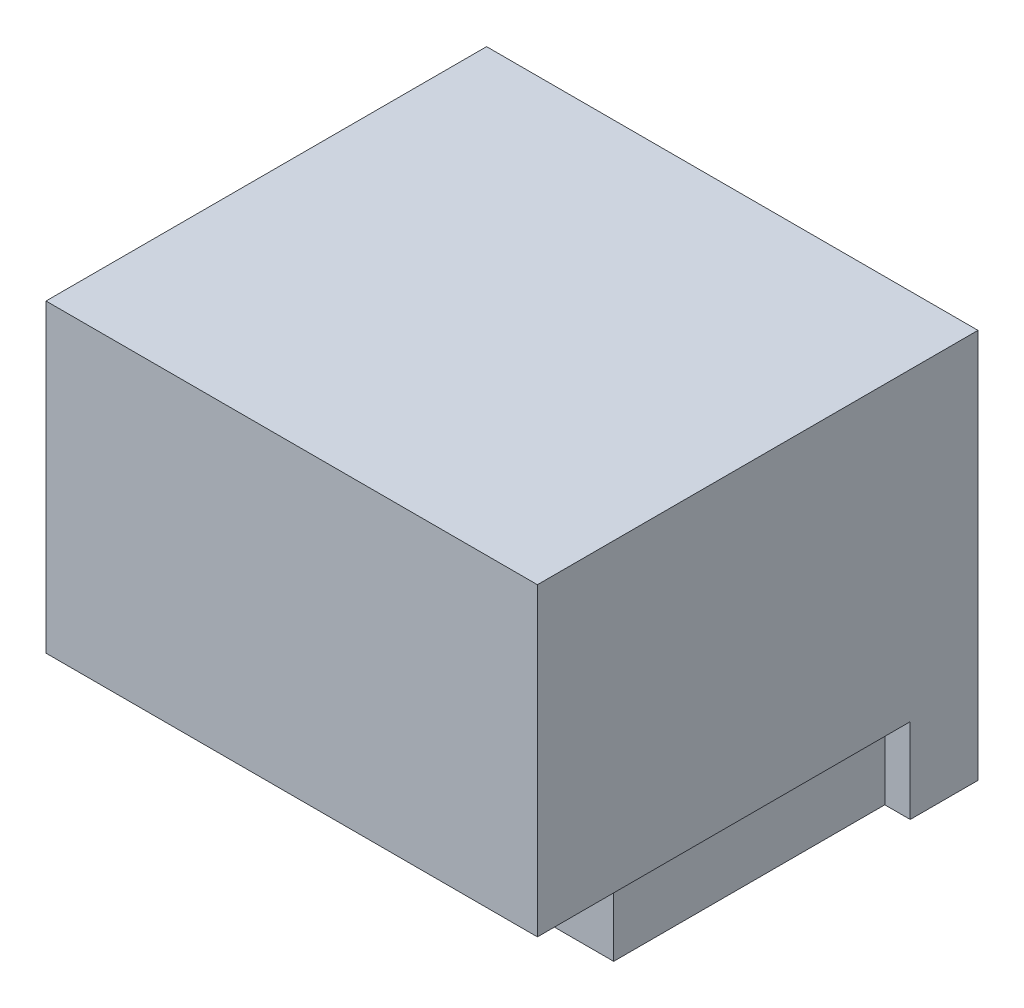
ISO-10303-21;
HEADER;
FILE_DESCRIPTION(('STEP AP214'),'2;1');
FILE_NAME('part.step','',(''),(''),'','','');
FILE_SCHEMA(('AUTOMOTIVE_DESIGN { 1 0 10303 214 1 1 1 1 }'));
ENDSEC;
DATA;
#1=APPLICATION_CONTEXT('core data for automotive mechanical design processes');
#2=APPLICATION_PROTOCOL_DEFINITION('international standard','automotive_design',2000,#1);
#3=PRODUCT_CONTEXT('',#1,'mechanical');
#4=PRODUCT('Part','Part','',(#3));
#5=PRODUCT_RELATED_PRODUCT_CATEGORY('part','',(#4));
#6=PRODUCT_DEFINITION_FORMATION('','',#4);
#7=PRODUCT_DEFINITION_CONTEXT('part definition',#1,'design');
#8=PRODUCT_DEFINITION('design','',#6,#7);
#9=PRODUCT_DEFINITION_SHAPE('','',#8);
#10=(LENGTH_UNIT() NAMED_UNIT(*) SI_UNIT(.MILLI.,.METRE.));
#11=(NAMED_UNIT(*) PLANE_ANGLE_UNIT() SI_UNIT($,.RADIAN.));
#12=(NAMED_UNIT(*) SI_UNIT($,.STERADIAN.) SOLID_ANGLE_UNIT());
#13=UNCERTAINTY_MEASURE_WITH_UNIT(LENGTH_MEASURE(1.E-05),#10,'distance_accuracy_value','');
#14=(GEOMETRIC_REPRESENTATION_CONTEXT(3) GLOBAL_UNCERTAINTY_ASSIGNED_CONTEXT((#13)) GLOBAL_UNIT_ASSIGNED_CONTEXT((#10,
#11,#12)) REPRESENTATION_CONTEXT('',''));
#15=CARTESIAN_POINT('',(0.,0.,0.));
#16=DIRECTION('',(0.,0.,1.));
#17=DIRECTION('',(1.,0.,0.));
#18=AXIS2_PLACEMENT_3D('',#15,#16,#17);
#19=CARTESIAN_POINT('',(0.,0.,0.));
#20=DIRECTION('',(0.,1.,0.));
#21=DIRECTION('',(0.,0.,1.));
#22=AXIS2_PLACEMENT_3D('',#19,#20,#21);
#23=PLANE('',#22);
#24=DIRECTION('',(-1.,0.,0.));
#25=VECTOR('',#24,1.);
#26=CARTESIAN_POINT('',(-5.73575949367089,0.,-3.50632911392403));
#27=LINE('',#26,#25);
#28=CARTESIAN_POINT('',(-4.98575949367089,0.,-3.50632911392403));
#29=VERTEX_POINT('',#28);
#30=CARTESIAN_POINT('',(-5.73575949367089,0.,-3.50632911392403));
#31=VERTEX_POINT('',#30);
#32=EDGE_CURVE('E494',#29,#31,#27,.T.);
#33=ORIENTED_EDGE('',*,*,#32,.F.);
#34=DIRECTION('',(0.,0.,-1.));
#35=VECTOR('',#34,1.);
#36=CARTESIAN_POINT('',(-4.98575949367089,0.,4.49367088607597));
#37=LINE('',#36,#35);
#38=CARTESIAN_POINT('',(-4.98575949367089,0.,4.49367088607597));
#39=VERTEX_POINT('',#38);
#40=EDGE_CURVE('E510',#39,#29,#37,.T.);
#41=ORIENTED_EDGE('',*,*,#40,.F.);
#42=DIRECTION('',(-1.,0.,0.));
#43=VECTOR('',#42,1.);
#44=CARTESIAN_POINT('',(-4.98575949367089,0.,4.49367088607597));
#45=LINE('',#44,#43);
#46=CARTESIAN_POINT('',(8.01424050632911,0.,4.49367088607597));
#47=VERTEX_POINT('',#46);
#48=EDGE_CURVE('E546',#47,#39,#45,.T.);
#49=ORIENTED_EDGE('',*,*,#48,.F.);
#50=DIRECTION('',(0.,0.,1.));
#51=VECTOR('',#50,1.);
#52=CARTESIAN_POINT('',(8.01424050632911,0.,4.49367088607597));
#53=LINE('',#52,#51);
#54=CARTESIAN_POINT('',(8.01424050632911,0.,-3.50632911392403));
#55=VERTEX_POINT('',#54);
#56=EDGE_CURVE('E542',#55,#47,#53,.T.);
#57=ORIENTED_EDGE('',*,*,#56,.F.);
#58=DIRECTION('',(-1.,0.,0.));
#59=VECTOR('',#58,1.);
#60=CARTESIAN_POINT('',(8.01424050632911,0.,-3.50632911392403));
#61=LINE('',#60,#59);
#62=CARTESIAN_POINT('',(8.76424050632911,0.,-3.50632911392403));
#63=VERTEX_POINT('',#62);
#64=EDGE_CURVE('E538',#63,#55,#61,.T.);
#65=ORIENTED_EDGE('',*,*,#64,.F.);
#66=DIRECTION('',(0.,0.,-1.));
#67=VECTOR('',#66,1.);
#68=CARTESIAN_POINT('',(8.76424050632911,0.,-5.50632911392403));
#69=LINE('',#68,#67);
#70=CARTESIAN_POINT('',(8.76424050632911,0.,7.49367088607597));
#71=VERTEX_POINT('',#70);
#72=EDGE_CURVE('E582',#71,#63,#69,.T.);
#73=ORIENTED_EDGE('',*,*,#72,.F.);
#74=DIRECTION('',(1.,0.,0.));
#75=VECTOR('',#74,1.);
#76=CARTESIAN_POINT('',(-5.73575949367089,0.,7.49367088607597));
#77=LINE('',#76,#75);
#78=CARTESIAN_POINT('',(-5.73575949367089,0.,7.49367088607597));
#79=VERTEX_POINT('',#78);
#80=EDGE_CURVE('E594',#79,#71,#77,.T.);
#81=ORIENTED_EDGE('',*,*,#80,.F.);
#82=DIRECTION('',(0.,0.,1.));
#83=VECTOR('',#82,1.);
#84=CARTESIAN_POINT('',(-5.73575949367089,0.,-5.50632911392403));
#85=LINE('',#84,#83);
#86=EDGE_CURVE('E576',#31,#79,#85,.T.);
#87=ORIENTED_EDGE('',*,*,#86,.F.);
#88=EDGE_LOOP('',(#33,#41,#49,#57,#65,#73,#81,#87));
#89=FACE_BOUND('',#88,.T.);
#90=ADVANCED_FACE('F39',(#89),#23,.F.);
#91=CARTESIAN_POINT('',(-5.73575949367089,9.,-5.50632911392403));
#92=DIRECTION('',(1.,0.,0.));
#93=DIRECTION('',(0.,0.,-1.));
#94=AXIS2_PLACEMENT_3D('',#91,#92,#93);
#95=PLANE('',#94);
#96=DIRECTION('',(0.,-1.,0.));
#97=VECTOR('',#96,1.);
#98=CARTESIAN_POINT('',(-5.73575949367089,9.,-5.50632911392403));
#99=LINE('',#98,#97);
#100=CARTESIAN_POINT('',(-5.73575949367089,9.,-5.50632911392403));
#101=VERTEX_POINT('',#100);
#102=CARTESIAN_POINT('',(-5.73575949367089,-2.5,-5.50632911392403));
#103=VERTEX_POINT('',#102);
#104=EDGE_CURVE('E591',#101,#103,#99,.T.);
#105=ORIENTED_EDGE('',*,*,#104,.T.);
#106=DIRECTION('',(0.,0.,-1.));
#107=VECTOR('',#106,1.);
#108=CARTESIAN_POINT('',(-5.73575949367089,-2.5,-3.50632911392403));
#109=LINE('',#108,#107);
#110=CARTESIAN_POINT('',(-5.73575949367089,-2.5,-3.50632911392403));
#111=VERTEX_POINT('',#110);
#112=EDGE_CURVE('E509',#111,#103,#109,.T.);
#113=ORIENTED_EDGE('',*,*,#112,.F.);
#114=DIRECTION('',(0.,1.,0.));
#115=VECTOR('',#114,1.);
#116=CARTESIAN_POINT('',(-5.73575949367089,-2.5,-3.50632911392403));
#117=LINE('',#116,#115);
#118=EDGE_CURVE('E572',#111,#31,#117,.T.);
#119=ORIENTED_EDGE('',*,*,#118,.T.);
#120=ORIENTED_EDGE('',*,*,#86,.T.);
#121=DIRECTION('',(0.,-1.,0.));
#122=VECTOR('',#121,1.);
#123=CARTESIAN_POINT('',(-5.73575949367089,9.,7.49367088607597));
#124=LINE('',#123,#122);
#125=CARTESIAN_POINT('',(-5.73575949367089,9.,7.49367088607597));
#126=VERTEX_POINT('',#125);
#127=EDGE_CURVE('E610',#126,#79,#124,.T.);
#128=ORIENTED_EDGE('',*,*,#127,.F.);
#129=DIRECTION('',(0.,0.,1.));
#130=VECTOR('',#129,1.);
#131=CARTESIAN_POINT('',(-5.73575949367089,9.,-5.50632911392403));
#132=LINE('',#131,#130);
#133=EDGE_CURVE('E577',#101,#126,#132,.T.);
#134=ORIENTED_EDGE('',*,*,#133,.F.);
#135=EDGE_LOOP('',(#105,#113,#119,#120,#128,#134));
#136=FACE_BOUND('',#135,.T.);
#137=ADVANCED_FACE('F41',(#136),#95,.F.);
#138=CARTESIAN_POINT('',(-5.73575949367089,9.,7.49367088607597));
#139=DIRECTION('',(0.,0.,-1.));
#140=DIRECTION('',(-1.,0.,0.));
#141=AXIS2_PLACEMENT_3D('',#138,#139,#140);
#142=PLANE('',#141);
#143=ORIENTED_EDGE('',*,*,#80,.T.);
#144=DIRECTION('',(0.,-1.,0.));
#145=VECTOR('',#144,1.);
#146=CARTESIAN_POINT('',(8.76424050632911,9.,7.49367088607597));
#147=LINE('',#146,#145);
#148=CARTESIAN_POINT('',(8.76424050632911,9.,7.49367088607597));
#149=VERTEX_POINT('',#148);
#150=EDGE_CURVE('E606',#149,#71,#147,.T.);
#151=ORIENTED_EDGE('',*,*,#150,.F.);
#152=DIRECTION('',(1.,0.,0.));
#153=VECTOR('',#152,1.);
#154=CARTESIAN_POINT('',(-5.73575949367089,9.,7.49367088607597));
#155=LINE('',#154,#153);
#156=EDGE_CURVE('E581',#126,#149,#155,.T.);
#157=ORIENTED_EDGE('',*,*,#156,.F.);
#158=ORIENTED_EDGE('',*,*,#127,.T.);
#159=EDGE_LOOP('',(#143,#151,#157,#158));
#160=FACE_BOUND('',#159,.T.);
#161=ADVANCED_FACE('F720',(#160),#142,.F.);
#162=CARTESIAN_POINT('',(8.76424050632911,9.,-5.50632911392403));
#163=DIRECTION('',(-1.,0.,0.));
#164=DIRECTION('',(0.,0.,1.));
#165=AXIS2_PLACEMENT_3D('',#162,#163,#164);
#166=PLANE('',#165);
#167=ORIENTED_EDGE('',*,*,#72,.T.);
#168=DIRECTION('',(0.,1.,0.));
#169=VECTOR('',#168,1.);
#170=CARTESIAN_POINT('',(8.76424050632911,-2.5,-3.50632911392403));
#171=LINE('',#170,#169);
#172=CARTESIAN_POINT('',(8.76424050632911,-2.5,-3.50632911392403));
#173=VERTEX_POINT('',#172);
#174=EDGE_CURVE('E568',#173,#63,#171,.T.);
#175=ORIENTED_EDGE('',*,*,#174,.F.);
#176=DIRECTION('',(0.,0.,1.));
#177=VECTOR('',#176,1.);
#178=CARTESIAN_POINT('',(8.76424050632911,-2.5,-3.50632911392403));
#179=LINE('',#178,#177);
#180=CARTESIAN_POINT('',(8.76424050632911,-2.5,-5.50632911392403));
#181=VERTEX_POINT('',#180);
#182=EDGE_CURVE('E519',#181,#173,#179,.T.);
#183=ORIENTED_EDGE('',*,*,#182,.F.);
#184=DIRECTION('',(0.,-1.,0.));
#185=VECTOR('',#184,1.);
#186=CARTESIAN_POINT('',(8.76424050632911,9.,-5.50632911392403));
#187=LINE('',#186,#185);
#188=CARTESIAN_POINT('',(8.76424050632911,9.,-5.50632911392403));
#189=VERTEX_POINT('',#188);
#190=EDGE_CURVE('E602',#189,#181,#187,.T.);
#191=ORIENTED_EDGE('',*,*,#190,.F.);
#192=DIRECTION('',(0.,0.,-1.));
#193=VECTOR('',#192,1.);
#194=CARTESIAN_POINT('',(8.76424050632911,9.,-5.50632911392403));
#195=LINE('',#194,#193);
#196=EDGE_CURVE('E585',#149,#189,#195,.T.);
#197=ORIENTED_EDGE('',*,*,#196,.F.);
#198=ORIENTED_EDGE('',*,*,#150,.T.);
#199=EDGE_LOOP('',(#167,#175,#183,#191,#197,#198));
#200=FACE_BOUND('',#199,.T.);
#201=ADVANCED_FACE('F669',(#200),#166,.F.);
#202=CARTESIAN_POINT('',(-5.73575949367089,9.,-5.50632911392403));
#203=DIRECTION('',(0.,0.,1.));
#204=DIRECTION('',(1.,0.,0.));
#205=AXIS2_PLACEMENT_3D('',#202,#203,#204);
#206=PLANE('',#205);
#207=DIRECTION('',(-1.,0.,0.));
#208=VECTOR('',#207,1.);
#209=CARTESIAN_POINT('',(7.51424050632911,0.,-5.50632911392403));
#210=LINE('',#209,#208);
#211=CARTESIAN_POINT('',(-1.48575949367089,0.,-5.50632911392403));
#212=VERTEX_POINT('',#211);
#213=CARTESIAN_POINT('',(-4.48575949367089,0.,-5.50632911392403));
#214=VERTEX_POINT('',#213);
#215=EDGE_CURVE('E479',#212,#214,#210,.T.);
#216=ORIENTED_EDGE('',*,*,#215,.F.);
#217=DIRECTION('',(0.,1.,0.));
#218=VECTOR('',#217,1.);
#219=CARTESIAN_POINT('',(-1.48575949367089,0.,-5.50632911392403));
#220=LINE('',#219,#218);
#221=CARTESIAN_POINT('',(-1.48575949367089,-1.5,-5.50632911392403));
#222=VERTEX_POINT('',#221);
#223=EDGE_CURVE('E408',#222,#212,#220,.T.);
#224=ORIENTED_EDGE('',*,*,#223,.F.);
#225=DIRECTION('',(-1.,0.,0.));
#226=VECTOR('',#225,1.);
#227=CARTESIAN_POINT('',(-0.235759493670888,-1.5,-5.50632911392403));
#228=LINE('',#227,#226);
#229=CARTESIAN_POINT('',(-0.235759493670888,-1.5,-5.50632911392403));
#230=VERTEX_POINT('',#229);
#231=EDGE_CURVE('E428',#230,#222,#228,.T.);
#232=ORIENTED_EDGE('',*,*,#231,.F.);
#233=DIRECTION('',(0.,1.,0.));
#234=VECTOR('',#233,1.);
#235=CARTESIAN_POINT('',(-0.235759493670888,-1.5,-5.50632911392403));
#236=LINE('',#235,#234);
#237=CARTESIAN_POINT('',(-0.235759493670888,-2.5,-5.50632911392403));
#238=VERTEX_POINT('',#237);
#239=EDGE_CURVE('E424',#238,#230,#236,.T.);
#240=ORIENTED_EDGE('',*,*,#239,.F.);
#241=DIRECTION('',(1.,0.,0.));
#242=VECTOR('',#241,1.);
#243=CARTESIAN_POINT('',(-5.73575949367089,-2.5,-5.50632911392403));
#244=LINE('',#243,#242);
#245=EDGE_CURVE('E515',#103,#238,#244,.T.);
#246=ORIENTED_EDGE('',*,*,#245,.F.);
#247=ORIENTED_EDGE('',*,*,#104,.F.);
#248=DIRECTION('',(-1.,0.,0.));
#249=VECTOR('',#248,1.);
#250=CARTESIAN_POINT('',(-5.73575949367089,9.,-5.50632911392403));
#251=LINE('',#250,#249);
#252=EDGE_CURVE('E588',#189,#101,#251,.T.);
#253=ORIENTED_EDGE('',*,*,#252,.F.);
#254=ORIENTED_EDGE('',*,*,#190,.T.);
#255=CARTESIAN_POINT('',(3.26424050632911,-2.5,-5.50632911392403));
#256=VERTEX_POINT('',#255);
#257=EDGE_CURVE('E514',#256,#181,#244,.T.);
#258=ORIENTED_EDGE('',*,*,#257,.F.);
#259=DIRECTION('',(0.,-1.,0.));
#260=VECTOR('',#259,1.);
#261=CARTESIAN_POINT('',(3.26424050632911,-1.5,-5.50632911392403));
#262=LINE('',#261,#260);
#263=CARTESIAN_POINT('',(3.26424050632911,-1.5,-5.50632911392403));
#264=VERTEX_POINT('',#263);
#265=EDGE_CURVE('E420',#264,#256,#262,.T.);
#266=ORIENTED_EDGE('',*,*,#265,.F.);
#267=DIRECTION('',(-1.,0.,0.));
#268=VECTOR('',#267,1.);
#269=CARTESIAN_POINT('',(4.51424050632911,-1.5,-5.50632911392403));
#270=LINE('',#269,#268);
#271=CARTESIAN_POINT('',(4.51424050632911,-1.5,-5.50632911392403));
#272=VERTEX_POINT('',#271);
#273=EDGE_CURVE('E416',#272,#264,#270,.T.);
#274=ORIENTED_EDGE('',*,*,#273,.F.);
#275=DIRECTION('',(0.,-1.,0.));
#276=VECTOR('',#275,1.);
#277=CARTESIAN_POINT('',(4.51424050632911,0.,-5.50632911392403));
#278=LINE('',#277,#276);
#279=CARTESIAN_POINT('',(4.51424050632911,0.,-5.50632911392403));
#280=VERTEX_POINT('',#279);
#281=EDGE_CURVE('E412',#280,#272,#278,.T.);
#282=ORIENTED_EDGE('',*,*,#281,.F.);
#283=CARTESIAN_POINT('',(7.51424050632911,0.,-5.50632911392403));
#284=VERTEX_POINT('',#283);
#285=EDGE_CURVE('E480',#284,#280,#210,.T.);
#286=ORIENTED_EDGE('',*,*,#285,.F.);
#287=DIRECTION('',(0.,-1.,0.));
#288=VECTOR('',#287,1.);
#289=CARTESIAN_POINT('',(7.51424050632911,7.,-5.50632911392403));
#290=LINE('',#289,#288);
#291=CARTESIAN_POINT('',(7.51424050632911,7.,-5.50632911392403));
#292=VERTEX_POINT('',#291);
#293=EDGE_CURVE('E438',#292,#284,#290,.T.);
#294=ORIENTED_EDGE('',*,*,#293,.F.);
#295=DIRECTION('',(1.,0.,0.));
#296=VECTOR('',#295,1.);
#297=CARTESIAN_POINT('',(7.51424050632911,7.,-5.50632911392403));
#298=LINE('',#297,#296);
#299=CARTESIAN_POINT('',(-4.48575949367089,7.,-5.50632911392403));
#300=VERTEX_POINT('',#299);
#301=EDGE_CURVE('E464',#300,#292,#298,.T.);
#302=ORIENTED_EDGE('',*,*,#301,.F.);
#303=DIRECTION('',(0.,1.,0.));
#304=VECTOR('',#303,1.);
#305=CARTESIAN_POINT('',(-4.48575949367089,7.,-5.50632911392403));
#306=LINE('',#305,#304);
#307=EDGE_CURVE('E484',#214,#300,#306,.T.);
#308=ORIENTED_EDGE('',*,*,#307,.F.);
#309=EDGE_LOOP('',(#216,#224,#232,#240,#246,#247,#253,#254,#258,#266,#274,#282,#286,#294,#302,#308));
#310=FACE_BOUND('',#309,.T.);
#311=ADVANCED_FACE('F656',(#310),#206,.F.);
#312=CARTESIAN_POINT('',(0.,9.,0.));
#313=DIRECTION('',(0.,1.,0.));
#314=DIRECTION('',(0.,0.,1.));
#315=AXIS2_PLACEMENT_3D('',#312,#313,#314);
#316=PLANE('',#315);
#317=ORIENTED_EDGE('',*,*,#133,.T.);
#318=ORIENTED_EDGE('',*,*,#156,.T.);
#319=ORIENTED_EDGE('',*,*,#196,.T.);
#320=ORIENTED_EDGE('',*,*,#252,.T.);
#321=EDGE_LOOP('',(#317,#318,#319,#320));
#322=FACE_BOUND('',#321,.T.);
#323=ADVANCED_FACE('F723',(#322),#316,.T.);
#324=CARTESIAN_POINT('',(-5.73575949367089,-2.5,-3.50632911392403));
#325=DIRECTION('',(0.,0.,-1.));
#326=DIRECTION('',(-1.,0.,0.));
#327=AXIS2_PLACEMENT_3D('',#324,#325,#326);
#328=PLANE('',#327);
#329=ORIENTED_EDGE('',*,*,#32,.T.);
#330=ORIENTED_EDGE('',*,*,#118,.F.);
#331=DIRECTION('',(-1.,0.,0.));
#332=VECTOR('',#331,1.);
#333=CARTESIAN_POINT('',(-5.73575949367089,-2.5,-3.50632911392403));
#334=LINE('',#333,#332);
#335=CARTESIAN_POINT('',(-4.98575949367089,-2.5,-3.50632911392403));
#336=VERTEX_POINT('',#335);
#337=EDGE_CURVE('E505',#336,#111,#334,.T.);
#338=ORIENTED_EDGE('',*,*,#337,.F.);
#339=DIRECTION('',(0.,1.,0.));
#340=VECTOR('',#339,1.);
#341=CARTESIAN_POINT('',(-4.98575949367089,-2.5,-3.50632911392403));
#342=LINE('',#341,#340);
#343=EDGE_CURVE('E534',#336,#29,#342,.T.);
#344=ORIENTED_EDGE('',*,*,#343,.T.);
#345=EDGE_LOOP('',(#329,#330,#338,#344));
#346=FACE_BOUND('',#345,.T.);
#347=ADVANCED_FACE('F691',(#346),#328,.F.);
#348=CARTESIAN_POINT('',(8.01424050632911,-2.5,-3.50632911392403));
#349=DIRECTION('',(0.,0.,-1.));
#350=DIRECTION('',(-1.,0.,0.));
#351=AXIS2_PLACEMENT_3D('',#348,#349,#350);
#352=PLANE('',#351);
#353=ORIENTED_EDGE('',*,*,#64,.T.);
#354=DIRECTION('',(0.,1.,0.));
#355=VECTOR('',#354,1.);
#356=CARTESIAN_POINT('',(8.01424050632911,-2.5,-3.50632911392403));
#357=LINE('',#356,#355);
#358=CARTESIAN_POINT('',(8.01424050632911,-2.5,-3.50632911392403));
#359=VERTEX_POINT('',#358);
#360=EDGE_CURVE('E564',#359,#55,#357,.T.);
#361=ORIENTED_EDGE('',*,*,#360,.F.);
#362=DIRECTION('',(-1.,0.,0.));
#363=VECTOR('',#362,1.);
#364=CARTESIAN_POINT('',(8.01424050632911,-2.5,-3.50632911392403));
#365=LINE('',#364,#363);
#366=EDGE_CURVE('E522',#173,#359,#365,.T.);
#367=ORIENTED_EDGE('',*,*,#366,.F.);
#368=ORIENTED_EDGE('',*,*,#174,.T.);
#369=EDGE_LOOP('',(#353,#361,#367,#368));
#370=FACE_BOUND('',#369,.T.);
#371=ADVANCED_FACE('F674',(#370),#352,.F.);
#372=CARTESIAN_POINT('',(8.01424050632911,-2.5,4.49367088607597));
#373=DIRECTION('',(-1.,0.,0.));
#374=DIRECTION('',(0.,0.,1.));
#375=AXIS2_PLACEMENT_3D('',#372,#373,#374);
#376=PLANE('',#375);
#377=ORIENTED_EDGE('',*,*,#56,.T.);
#378=DIRECTION('',(0.,1.,0.));
#379=VECTOR('',#378,1.);
#380=CARTESIAN_POINT('',(8.01424050632911,-2.5,4.49367088607597));
#381=LINE('',#380,#379);
#382=CARTESIAN_POINT('',(8.01424050632911,-2.5,4.49367088607597));
#383=VERTEX_POINT('',#382);
#384=EDGE_CURVE('E560',#383,#47,#381,.T.);
#385=ORIENTED_EDGE('',*,*,#384,.F.);
#386=DIRECTION('',(0.,0.,1.));
#387=VECTOR('',#386,1.);
#388=CARTESIAN_POINT('',(8.01424050632911,-2.5,4.49367088607597));
#389=LINE('',#388,#387);
#390=EDGE_CURVE('E525',#359,#383,#389,.T.);
#391=ORIENTED_EDGE('',*,*,#390,.F.);
#392=ORIENTED_EDGE('',*,*,#360,.T.);
#393=EDGE_LOOP('',(#377,#385,#391,#392));
#394=FACE_BOUND('',#393,.T.);
#395=ADVANCED_FACE('F680',(#394),#376,.F.);
#396=CARTESIAN_POINT('',(-4.98575949367089,-2.5,4.49367088607597));
#397=DIRECTION('',(0.,0.,-1.));
#398=DIRECTION('',(-1.,0.,0.));
#399=AXIS2_PLACEMENT_3D('',#396,#397,#398);
#400=PLANE('',#399);
#401=ORIENTED_EDGE('',*,*,#48,.T.);
#402=DIRECTION('',(0.,1.,0.));
#403=VECTOR('',#402,1.);
#404=CARTESIAN_POINT('',(-4.98575949367089,-2.5,4.49367088607597));
#405=LINE('',#404,#403);
#406=CARTESIAN_POINT('',(-4.98575949367089,-2.5,4.49367088607597));
#407=VERTEX_POINT('',#406);
#408=EDGE_CURVE('E556',#407,#39,#405,.T.);
#409=ORIENTED_EDGE('',*,*,#408,.F.);
#410=DIRECTION('',(-1.,0.,0.));
#411=VECTOR('',#410,1.);
#412=CARTESIAN_POINT('',(-4.98575949367089,-2.5,4.49367088607597));
#413=LINE('',#412,#411);
#414=EDGE_CURVE('E528',#383,#407,#413,.T.);
#415=ORIENTED_EDGE('',*,*,#414,.F.);
#416=ORIENTED_EDGE('',*,*,#384,.T.);
#417=EDGE_LOOP('',(#401,#409,#415,#416));
#418=FACE_BOUND('',#417,.T.);
#419=ADVANCED_FACE('F682',(#418),#400,.F.);
#420=CARTESIAN_POINT('',(-4.98575949367089,-2.5,4.49367088607597));
#421=DIRECTION('',(1.,0.,0.));
#422=DIRECTION('',(0.,0.,-1.));
#423=AXIS2_PLACEMENT_3D('',#420,#421,#422);
#424=PLANE('',#423);
#425=ORIENTED_EDGE('',*,*,#40,.T.);
#426=ORIENTED_EDGE('',*,*,#343,.F.);
#427=DIRECTION('',(0.,0.,-1.));
#428=VECTOR('',#427,1.);
#429=CARTESIAN_POINT('',(-4.98575949367089,-2.5,4.49367088607597));
#430=LINE('',#429,#428);
#431=EDGE_CURVE('E531',#407,#336,#430,.T.);
#432=ORIENTED_EDGE('',*,*,#431,.F.);
#433=ORIENTED_EDGE('',*,*,#408,.T.);
#434=EDGE_LOOP('',(#425,#426,#432,#433));
#435=FACE_BOUND('',#434,.T.);
#436=ADVANCED_FACE('F686',(#435),#424,.F.);
#437=CARTESIAN_POINT('',(0.,-2.5,0.));
#438=DIRECTION('',(0.,1.,0.));
#439=DIRECTION('',(0.,0.,1.));
#440=AXIS2_PLACEMENT_3D('',#437,#438,#439);
#441=PLANE('',#440);
#442=DIRECTION('',(1.,0.,0.));
#443=VECTOR('',#442,1.);
#444=CARTESIAN_POINT('',(-4.11575949367089,-2.5,-4.37535893453436));
#445=LINE('',#444,#443);
#446=CARTESIAN_POINT('',(-4.11575949367089,-2.5,-4.37535893453436));
#447=VERTEX_POINT('',#446);
#448=CARTESIAN_POINT('',(-3.11575949367089,-2.5,-4.37535893453436));
#449=VERTEX_POINT('',#448);
#450=EDGE_CURVE('E297',#447,#449,#445,.T.);
#451=ORIENTED_EDGE('',*,*,#450,.F.);
#452=DIRECTION('',(0.,0.,-1.));
#453=VECTOR('',#452,1.);
#454=CARTESIAN_POINT('',(-4.11575949367089,-2.5,3.62464106546564));
#455=LINE('',#454,#453);
#456=CARTESIAN_POINT('',(-4.11575949367089,-2.5,3.62464106546564));
#457=VERTEX_POINT('',#456);
#458=EDGE_CURVE('E55',#457,#447,#455,.T.);
#459=ORIENTED_EDGE('',*,*,#458,.F.);
#460=DIRECTION('',(-1.,0.,0.));
#461=VECTOR('',#460,1.);
#462=CARTESIAN_POINT('',(-4.11575949367089,-2.5,3.62464106546564));
#463=LINE('',#462,#461);
#464=CARTESIAN_POINT('',(-3.11575949367089,-2.5,3.62464106546564));
#465=VERTEX_POINT('',#464);
#466=EDGE_CURVE('E284',#465,#457,#463,.T.);
#467=ORIENTED_EDGE('',*,*,#466,.F.);
#468=DIRECTION('',(0.,0.,1.));
#469=VECTOR('',#468,1.);
#470=CARTESIAN_POINT('',(-3.11575949367089,-2.5,3.62464106546564));
#471=LINE('',#470,#469);
#472=EDGE_CURVE('E288',#449,#465,#471,.T.);
#473=ORIENTED_EDGE('',*,*,#472,.F.);
#474=EDGE_LOOP('',(#451,#459,#467,#473));
#475=FACE_BOUND('',#474,.T.);
#476=DIRECTION('',(1.,0.,0.));
#477=VECTOR('',#476,1.);
#478=CARTESIAN_POINT('',(6.14424050632912,-2.5,-4.37535893453436));
#479=LINE('',#478,#477);
#480=CARTESIAN_POINT('',(6.14424050632912,-2.5,-4.37535893453436));
#481=VERTEX_POINT('',#480);
#482=CARTESIAN_POINT('',(7.14424050632911,-2.5,-4.37535893453436));
#483=VERTEX_POINT('',#482);
#484=EDGE_CURVE('E333',#481,#483,#479,.T.);
#485=ORIENTED_EDGE('',*,*,#484,.F.);
#486=DIRECTION('',(0.,0.,-1.));
#487=VECTOR('',#486,1.);
#488=CARTESIAN_POINT('',(6.14424050632911,-2.5,3.62464106546564));
#489=LINE('',#488,#487);
#490=CARTESIAN_POINT('',(6.14424050632911,-2.5,3.62464106546564));
#491=VERTEX_POINT('',#490);
#492=EDGE_CURVE('E63',#491,#481,#489,.T.);
#493=ORIENTED_EDGE('',*,*,#492,.F.);
#494=DIRECTION('',(-1.,0.,0.));
#495=VECTOR('',#494,1.);
#496=CARTESIAN_POINT('',(6.14424050632911,-2.5,3.62464106546564));
#497=LINE('',#496,#495);
#498=CARTESIAN_POINT('',(7.14424050632911,-2.5,3.62464106546564));
#499=VERTEX_POINT('',#498);
#500=EDGE_CURVE('E318',#499,#491,#497,.T.);
#501=ORIENTED_EDGE('',*,*,#500,.F.);
#502=DIRECTION('',(0.,0.,1.));
#503=VECTOR('',#502,1.);
#504=CARTESIAN_POINT('',(7.14424050632911,-2.5,3.62464106546564));
#505=LINE('',#504,#503);
#506=EDGE_CURVE('E337',#483,#499,#505,.T.);
#507=ORIENTED_EDGE('',*,*,#506,.F.);
#508=EDGE_LOOP('',(#485,#493,#501,#507));
#509=FACE_BOUND('',#508,.T.);
#510=DIRECTION('',(-1.,0.,0.));
#511=VECTOR('',#510,1.);
#512=CARTESIAN_POINT('',(3.26424050632911,-2.5,0.99367088607597));
#513=LINE('',#512,#511);
#514=CARTESIAN_POINT('',(5.27560239595902,-2.5,0.99367088607597));
#515=VERTEX_POINT('',#514);
#516=CARTESIAN_POINT('',(-2.2471213833008,-2.5,0.99367088607597));
#517=VERTEX_POINT('',#516);
#518=EDGE_CURVE('E404',#515,#517,#513,.T.);
#519=ORIENTED_EDGE('',*,*,#518,.F.);
#520=DIRECTION('',(0.,0.,1.));
#521=VECTOR('',#520,1.);
#522=CARTESIAN_POINT('',(5.27560239595902,-2.5,0.99367088607597));
#523=LINE('',#522,#521);
#524=CARTESIAN_POINT('',(5.27560239595902,-2.5,-4.00632911392403));
#525=VERTEX_POINT('',#524);
#526=EDGE_CURVE('E361',#525,#515,#523,.T.);
#527=ORIENTED_EDGE('',*,*,#526,.F.);
#528=DIRECTION('',(1.,0.,0.));
#529=VECTOR('',#528,1.);
#530=CARTESIAN_POINT('',(-2.2471213833008,-2.5,-4.00632911392403));
#531=LINE('',#530,#529);
#532=CARTESIAN_POINT('',(3.26424050632911,-2.5,-4.00632911392403));
#533=VERTEX_POINT('',#532);
#534=EDGE_CURVE('E357',#533,#525,#531,.T.);
#535=ORIENTED_EDGE('',*,*,#534,.F.);
#536=DIRECTION('',(0.,0.,-1.));
#537=VECTOR('',#536,1.);
#538=CARTESIAN_POINT('',(3.26424050632911,-2.5,0.99367088607597));
#539=LINE('',#538,#537);
#540=EDGE_CURVE('E451',#533,#256,#539,.T.);
#541=ORIENTED_EDGE('',*,*,#540,.T.);
#542=ORIENTED_EDGE('',*,*,#257,.T.);
#543=ORIENTED_EDGE('',*,*,#182,.T.);
#544=ORIENTED_EDGE('',*,*,#366,.T.);
#545=ORIENTED_EDGE('',*,*,#390,.T.);
#546=ORIENTED_EDGE('',*,*,#414,.T.);
#547=ORIENTED_EDGE('',*,*,#431,.T.);
#548=ORIENTED_EDGE('',*,*,#337,.T.);
#549=ORIENTED_EDGE('',*,*,#112,.T.);
#550=ORIENTED_EDGE('',*,*,#245,.T.);
#551=DIRECTION('',(0.,0.,-1.));
#552=VECTOR('',#551,1.);
#553=CARTESIAN_POINT('',(-0.235759493670888,-2.5,0.99367088607597));
#554=LINE('',#553,#552);
#555=CARTESIAN_POINT('',(-0.235759493670888,-2.5,-4.00632911392403));
#556=VERTEX_POINT('',#555);
#557=EDGE_CURVE('E448',#556,#238,#554,.T.);
#558=ORIENTED_EDGE('',*,*,#557,.F.);
#559=CARTESIAN_POINT('',(-2.2471213833008,-2.5,-4.00632911392403));
#560=VERTEX_POINT('',#559);
#561=EDGE_CURVE('E358',#560,#556,#531,.T.);
#562=ORIENTED_EDGE('',*,*,#561,.F.);
#563=DIRECTION('',(0.,0.,-1.));
#564=VECTOR('',#563,1.);
#565=CARTESIAN_POINT('',(-2.2471213833008,-2.5,0.99367088607597));
#566=LINE('',#565,#564);
#567=EDGE_CURVE('E307',#517,#560,#566,.T.);
#568=ORIENTED_EDGE('',*,*,#567,.F.);
#569=EDGE_LOOP('',(#519,#527,#535,#541,#542,#543,#544,#545,#546,#547,#548,#549,#550,#558,#562,#568));
#570=FACE_BOUND('',#569,.T.);
#571=ADVANCED_FACE('F635',(#475,#509,#570),#441,.F.);
#572=CARTESIAN_POINT('',(7.51424050632911,7.,4.19367088607597));
#573=DIRECTION('',(1.,0.,0.));
#574=DIRECTION('',(0.,1.,0.));
#575=AXIS2_PLACEMENT_3D('',#572,#573,#574);
#576=PLANE('',#575);
#577=ORIENTED_EDGE('',*,*,#293,.T.);
#578=DIRECTION('',(0.,0.,-1.));
#579=VECTOR('',#578,1.);
#580=CARTESIAN_POINT('',(7.51424050632911,0.,4.19367088607597));
#581=LINE('',#580,#579);
#582=CARTESIAN_POINT('',(7.51424050632911,0.,4.19367088607597));
#583=VERTEX_POINT('',#582);
#584=EDGE_CURVE('E476',#583,#284,#581,.T.);
#585=ORIENTED_EDGE('',*,*,#584,.F.);
#586=DIRECTION('',(0.,-1.,0.));
#587=VECTOR('',#586,1.);
#588=CARTESIAN_POINT('',(7.51424050632911,7.,4.19367088607597));
#589=LINE('',#588,#587);
#590=CARTESIAN_POINT('',(7.51424050632911,7.,4.19367088607597));
#591=VERTEX_POINT('',#590);
#592=EDGE_CURVE('E459',#591,#583,#589,.T.);
#593=ORIENTED_EDGE('',*,*,#592,.F.);
#594=DIRECTION('',(0.,0.,-1.));
#595=VECTOR('',#594,1.);
#596=CARTESIAN_POINT('',(7.51424050632911,7.,4.19367088607597));
#597=LINE('',#596,#595);
#598=EDGE_CURVE('E491',#591,#292,#597,.T.);
#599=ORIENTED_EDGE('',*,*,#598,.T.);
#600=EDGE_LOOP('',(#577,#585,#593,#599));
#601=FACE_BOUND('',#600,.T.);
#602=ADVANCED_FACE('F751',(#601),#576,.F.);
#603=CARTESIAN_POINT('',(7.51424050632911,7.,4.19367088607597));
#604=DIRECTION('',(0.,1.,0.));
#605=DIRECTION('',(0.,0.,1.));
#606=AXIS2_PLACEMENT_3D('',#603,#604,#605);
#607=PLANE('',#606);
#608=ORIENTED_EDGE('',*,*,#301,.T.);
#609=ORIENTED_EDGE('',*,*,#598,.F.);
#610=DIRECTION('',(1.,0.,0.));
#611=VECTOR('',#610,1.);
#612=CARTESIAN_POINT('',(7.51424050632911,7.,4.19367088607597));
#613=LINE('',#612,#611);
#614=CARTESIAN_POINT('',(-4.48575949367089,7.,4.19367088607597));
#615=VERTEX_POINT('',#614);
#616=EDGE_CURVE('E472',#615,#591,#613,.T.);
#617=ORIENTED_EDGE('',*,*,#616,.F.);
#618=DIRECTION('',(0.,0.,-1.));
#619=VECTOR('',#618,1.);
#620=CARTESIAN_POINT('',(-4.48575949367089,7.,4.19367088607597));
#621=LINE('',#620,#619);
#622=EDGE_CURVE('E495',#615,#300,#621,.T.);
#623=ORIENTED_EDGE('',*,*,#622,.T.);
#624=EDGE_LOOP('',(#608,#609,#617,#623));
#625=FACE_BOUND('',#624,.T.);
#626=ADVANCED_FACE('F755',(#625),#607,.F.);
#627=CARTESIAN_POINT('',(-4.48575949367089,7.,4.19367088607597));
#628=DIRECTION('',(-1.,0.,0.));
#629=DIRECTION('',(0.,0.,1.));
#630=AXIS2_PLACEMENT_3D('',#627,#628,#629);
#631=PLANE('',#630);
#632=ORIENTED_EDGE('',*,*,#307,.T.);
#633=ORIENTED_EDGE('',*,*,#622,.F.);
#634=DIRECTION('',(0.,1.,0.));
#635=VECTOR('',#634,1.);
#636=CARTESIAN_POINT('',(-4.48575949367089,7.,4.19367088607597));
#637=LINE('',#636,#635);
#638=CARTESIAN_POINT('',(-4.48575949367089,0.,4.19367088607597));
#639=VERTEX_POINT('',#638);
#640=EDGE_CURVE('E468',#639,#615,#637,.T.);
#641=ORIENTED_EDGE('',*,*,#640,.F.);
#642=DIRECTION('',(0.,0.,-1.));
#643=VECTOR('',#642,1.);
#644=CARTESIAN_POINT('',(-4.48575949367089,0.,4.19367088607597));
#645=LINE('',#644,#643);
#646=EDGE_CURVE('E498',#639,#214,#645,.T.);
#647=ORIENTED_EDGE('',*,*,#646,.T.);
#648=EDGE_LOOP('',(#632,#633,#641,#647));
#649=FACE_BOUND('',#648,.T.);
#650=ADVANCED_FACE('F760',(#649),#631,.F.);
#651=CARTESIAN_POINT('',(7.51424050632911,0.,4.19367088607597));
#652=DIRECTION('',(0.,-1.,0.));
#653=DIRECTION('',(0.,0.,-1.));
#654=AXIS2_PLACEMENT_3D('',#651,#652,#653);
#655=PLANE('',#654);
#656=DIRECTION('',(1.,0.,0.));
#657=VECTOR('',#656,1.);
#658=CARTESIAN_POINT('',(4.51424050632911,0.,0.99367088607597));
#659=LINE('',#658,#657);
#660=CARTESIAN_POINT('',(-2.2471213833008,0.,0.99367088607597));
#661=VERTEX_POINT('',#660);
#662=CARTESIAN_POINT('',(5.27560239595902,0.,0.99367088607597));
#663=VERTEX_POINT('',#662);
#664=EDGE_CURVE('E407',#661,#663,#659,.T.);
#665=ORIENTED_EDGE('',*,*,#664,.F.);
#666=DIRECTION('',(0.,0.,-1.));
#667=VECTOR('',#666,1.);
#668=CARTESIAN_POINT('',(-2.2471213833008,0.,4.19367088607597));
#669=LINE('',#668,#667);
#670=CARTESIAN_POINT('',(-2.2471213833008,0.,-4.00632911392403));
#671=VERTEX_POINT('',#670);
#672=EDGE_CURVE('E11',#661,#671,#669,.T.);
#673=ORIENTED_EDGE('',*,*,#672,.T.);
#674=DIRECTION('',(1.,0.,0.));
#675=VECTOR('',#674,1.);
#676=CARTESIAN_POINT('',(7.51424050632911,0.,-4.00632911392403));
#677=LINE('',#676,#675);
#678=CARTESIAN_POINT('',(-1.48575949367089,0.,-4.00632911392403));
#679=VERTEX_POINT('',#678);
#680=EDGE_CURVE('E392',#671,#679,#677,.T.);
#681=ORIENTED_EDGE('',*,*,#680,.T.);
#682=DIRECTION('',(0.,0.,-1.));
#683=VECTOR('',#682,1.);
#684=CARTESIAN_POINT('',(-1.48575949367089,0.,0.99367088607597));
#685=LINE('',#684,#683);
#686=EDGE_CURVE('E439',#679,#212,#685,.T.);
#687=ORIENTED_EDGE('',*,*,#686,.T.);
#688=ORIENTED_EDGE('',*,*,#215,.T.);
#689=ORIENTED_EDGE('',*,*,#646,.F.);
#690=DIRECTION('',(-1.,0.,0.));
#691=VECTOR('',#690,1.);
#692=CARTESIAN_POINT('',(7.51424050632911,0.,4.19367088607597));
#693=LINE('',#692,#691);
#694=EDGE_CURVE('E463',#583,#639,#693,.T.);
#695=ORIENTED_EDGE('',*,*,#694,.F.);
#696=ORIENTED_EDGE('',*,*,#584,.T.);
#697=ORIENTED_EDGE('',*,*,#285,.T.);
#698=DIRECTION('',(0.,0.,-1.));
#699=VECTOR('',#698,1.);
#700=CARTESIAN_POINT('',(4.51424050632911,0.,0.99367088607597));
#701=LINE('',#700,#699);
#702=CARTESIAN_POINT('',(4.51424050632911,0.,-4.00632911392403));
#703=VERTEX_POINT('',#702);
#704=EDGE_CURVE('E435',#703,#280,#701,.T.);
#705=ORIENTED_EDGE('',*,*,#704,.F.);
#706=CARTESIAN_POINT('',(5.27560239595902,0.,-4.00632911392403));
#707=VERTEX_POINT('',#706);
#708=EDGE_CURVE('E387',#703,#707,#677,.T.);
#709=ORIENTED_EDGE('',*,*,#708,.T.);
#710=DIRECTION('',(0.,0.,1.));
#711=VECTOR('',#710,1.);
#712=CARTESIAN_POINT('',(5.27560239595902,0.,4.19367088607597));
#713=LINE('',#712,#711);
#714=EDGE_CURVE('E48',#707,#663,#713,.T.);
#715=ORIENTED_EDGE('',*,*,#714,.T.);
#716=EDGE_LOOP('',(#665,#673,#681,#687,#688,#689,#695,#696,#697,#705,#709,#715));
#717=FACE_BOUND('',#716,.T.);
#718=ADVANCED_FACE('F620',(#717),#655,.F.);
#719=CARTESIAN_POINT('',(0.,0.,4.19367088607597));
#720=DIRECTION('',(0.,0.,-1.));
#721=DIRECTION('',(-1.,0.,0.));
#722=AXIS2_PLACEMENT_3D('',#719,#720,#721);
#723=PLANE('',#722);
#724=ORIENTED_EDGE('',*,*,#592,.T.);
#725=ORIENTED_EDGE('',*,*,#694,.T.);
#726=ORIENTED_EDGE('',*,*,#640,.T.);
#727=ORIENTED_EDGE('',*,*,#616,.T.);
#728=EDGE_LOOP('',(#724,#725,#726,#727));
#729=FACE_BOUND('',#728,.T.);
#730=ADVANCED_FACE('F759',(#729),#723,.T.);
#731=CARTESIAN_POINT('',(4.51424050632911,0.,0.99367088607597));
#732=DIRECTION('',(1.,0.,0.));
#733=DIRECTION('',(0.,0.,-1.));
#734=AXIS2_PLACEMENT_3D('',#731,#732,#733);
#735=PLANE('',#734);
#736=DIRECTION('',(0.,0.,-1.));
#737=VECTOR('',#736,1.);
#738=CARTESIAN_POINT('',(4.51424050632911,-1.5,0.99367088607597));
#739=LINE('',#738,#737);
#740=CARTESIAN_POINT('',(4.51424050632911,-1.5,-4.00632911392402));
#741=VERTEX_POINT('',#740);
#742=EDGE_CURVE('E411',#741,#272,#739,.T.);
#743=ORIENTED_EDGE('',*,*,#742,.F.);
#744=DIRECTION('',(0.,1.,0.));
#745=VECTOR('',#744,1.);
#746=CARTESIAN_POINT('',(4.51424050632911,0.,-4.00632911392403));
#747=LINE('',#746,#745);
#748=EDGE_CURVE('E383',#741,#703,#747,.T.);
#749=ORIENTED_EDGE('',*,*,#748,.T.);
#750=ORIENTED_EDGE('',*,*,#704,.T.);
#751=ORIENTED_EDGE('',*,*,#281,.T.);
#752=EDGE_LOOP('',(#743,#749,#750,#751));
#753=FACE_BOUND('',#752,.T.);
#754=ADVANCED_FACE('F712',(#753),#735,.F.);
#755=CARTESIAN_POINT('',(-1.48575949367089,0.,0.99367088607597));
#756=DIRECTION('',(-1.,0.,0.));
#757=DIRECTION('',(0.,-1.,0.));
#758=AXIS2_PLACEMENT_3D('',#755,#756,#757);
#759=PLANE('',#758);
#760=ORIENTED_EDGE('',*,*,#686,.F.);
#761=DIRECTION('',(0.,-1.,0.));
#762=VECTOR('',#761,1.);
#763=CARTESIAN_POINT('',(-1.48575949367089,0.,-4.00632911392403));
#764=LINE('',#763,#762);
#765=CARTESIAN_POINT('',(-1.48575949367089,-1.5,-4.00632911392403));
#766=VERTEX_POINT('',#765);
#767=EDGE_CURVE('E400',#679,#766,#764,.T.);
#768=ORIENTED_EDGE('',*,*,#767,.T.);
#769=DIRECTION('',(0.,0.,-1.));
#770=VECTOR('',#769,1.);
#771=CARTESIAN_POINT('',(-1.48575949367089,-1.5,0.99367088607597));
#772=LINE('',#771,#770);
#773=EDGE_CURVE('E442',#766,#222,#772,.T.);
#774=ORIENTED_EDGE('',*,*,#773,.T.);
#775=ORIENTED_EDGE('',*,*,#223,.T.);
#776=EDGE_LOOP('',(#760,#768,#774,#775));
#777=FACE_BOUND('',#776,.T.);
#778=ADVANCED_FACE('F649',(#777),#759,.F.);
#779=CARTESIAN_POINT('',(-0.235759493670888,-1.5,0.99367088607597));
#780=DIRECTION('',(0.,-1.,0.));
#781=DIRECTION('',(1.,0.,0.));
#782=AXIS2_PLACEMENT_3D('',#779,#780,#781);
#783=PLANE('',#782);
#784=ORIENTED_EDGE('',*,*,#773,.F.);
#785=DIRECTION('',(1.,0.,0.));
#786=VECTOR('',#785,1.);
#787=CARTESIAN_POINT('',(-0.235759493670888,-1.5,-4.00632911392403));
#788=LINE('',#787,#786);
#789=CARTESIAN_POINT('',(-0.235759493670888,-1.5,-4.00632911392403));
#790=VERTEX_POINT('',#789);
#791=EDGE_CURVE('E396',#766,#790,#788,.T.);
#792=ORIENTED_EDGE('',*,*,#791,.T.);
#793=DIRECTION('',(0.,0.,-1.));
#794=VECTOR('',#793,1.);
#795=CARTESIAN_POINT('',(-0.235759493670888,-1.5,0.99367088607597));
#796=LINE('',#795,#794);
#797=EDGE_CURVE('E445',#790,#230,#796,.T.);
#798=ORIENTED_EDGE('',*,*,#797,.T.);
#799=ORIENTED_EDGE('',*,*,#231,.T.);
#800=EDGE_LOOP('',(#784,#792,#798,#799));
#801=FACE_BOUND('',#800,.T.);
#802=ADVANCED_FACE('F703',(#801),#783,.F.);
#803=CARTESIAN_POINT('',(-0.235759493670888,-1.5,0.99367088607597));
#804=DIRECTION('',(-1.,0.,0.));
#805=DIRECTION('',(0.,-1.,0.));
#806=AXIS2_PLACEMENT_3D('',#803,#804,#805);
#807=PLANE('',#806);
#808=ORIENTED_EDGE('',*,*,#797,.F.);
#809=DIRECTION('',(0.,-1.,0.));
#810=VECTOR('',#809,1.);
#811=CARTESIAN_POINT('',(-0.235759493670888,-1.5,-4.00632911392403));
#812=LINE('',#811,#810);
#813=EDGE_CURVE('E391',#790,#556,#812,.T.);
#814=ORIENTED_EDGE('',*,*,#813,.T.);
#815=ORIENTED_EDGE('',*,*,#557,.T.);
#816=ORIENTED_EDGE('',*,*,#239,.T.);
#817=EDGE_LOOP('',(#808,#814,#815,#816));
#818=FACE_BOUND('',#817,.T.);
#819=ADVANCED_FACE('F700',(#818),#807,.F.);
#820=CARTESIAN_POINT('',(3.26424050632911,-1.5,0.99367088607597));
#821=DIRECTION('',(1.,0.,0.));
#822=DIRECTION('',(0.,1.,0.));
#823=AXIS2_PLACEMENT_3D('',#820,#821,#822);
#824=PLANE('',#823);
#825=ORIENTED_EDGE('',*,*,#540,.F.);
#826=DIRECTION('',(0.,1.,0.));
#827=VECTOR('',#826,1.);
#828=CARTESIAN_POINT('',(3.26424050632911,-1.5,-4.00632911392403));
#829=LINE('',#828,#827);
#830=CARTESIAN_POINT('',(3.26424050632911,-1.5,-4.00632911392403));
#831=VERTEX_POINT('',#830);
#832=EDGE_CURVE('E370',#533,#831,#829,.T.);
#833=ORIENTED_EDGE('',*,*,#832,.T.);
#834=DIRECTION('',(0.,0.,-1.));
#835=VECTOR('',#834,1.);
#836=CARTESIAN_POINT('',(3.26424050632911,-1.5,0.99367088607597));
#837=LINE('',#836,#835);
#838=EDGE_CURVE('E454',#831,#264,#837,.T.);
#839=ORIENTED_EDGE('',*,*,#838,.T.);
#840=ORIENTED_EDGE('',*,*,#265,.T.);
#841=EDGE_LOOP('',(#825,#833,#839,#840));
#842=FACE_BOUND('',#841,.T.);
#843=ADVANCED_FACE('F710',(#842),#824,.F.);
#844=CARTESIAN_POINT('',(4.51424050632911,-1.5,0.99367088607597));
#845=DIRECTION('',(0.,-1.,0.));
#846=DIRECTION('',(0.,0.,-1.));
#847=AXIS2_PLACEMENT_3D('',#844,#845,#846);
#848=PLANE('',#847);
#849=ORIENTED_EDGE('',*,*,#838,.F.);
#850=DIRECTION('',(1.,0.,0.));
#851=VECTOR('',#850,1.);
#852=CARTESIAN_POINT('',(4.51424050632911,-1.5,-4.00632911392403));
#853=LINE('',#852,#851);
#854=EDGE_CURVE('E614',#831,#741,#853,.T.);
#855=ORIENTED_EDGE('',*,*,#854,.T.);
#856=ORIENTED_EDGE('',*,*,#742,.T.);
#857=ORIENTED_EDGE('',*,*,#273,.T.);
#858=EDGE_LOOP('',(#849,#855,#856,#857));
#859=FACE_BOUND('',#858,.T.);
#860=ADVANCED_FACE('F773',(#859),#848,.F.);
#861=CARTESIAN_POINT('',(0.,0.,0.99367088607597));
#862=DIRECTION('',(0.,0.,-1.));
#863=DIRECTION('',(-1.,0.,0.));
#864=AXIS2_PLACEMENT_3D('',#861,#862,#863);
#865=PLANE('',#864);
#866=DIRECTION('',(0.,-1.,0.));
#867=VECTOR('',#866,1.);
#868=CARTESIAN_POINT('',(-2.2471213833008,4.,0.99367088607597));
#869=LINE('',#868,#867);
#870=EDGE_CURVE('E366',#661,#517,#869,.T.);
#871=ORIENTED_EDGE('',*,*,#870,.F.);
#872=ORIENTED_EDGE('',*,*,#664,.T.);
#873=DIRECTION('',(0.,-1.,0.));
#874=VECTOR('',#873,1.);
#875=CARTESIAN_POINT('',(5.27560239595902,4.,0.99367088607597));
#876=LINE('',#875,#874);
#877=EDGE_CURVE('E371',#663,#515,#876,.T.);
#878=ORIENTED_EDGE('',*,*,#877,.T.);
#879=ORIENTED_EDGE('',*,*,#518,.T.);
#880=EDGE_LOOP('',(#871,#872,#878,#879));
#881=FACE_BOUND('',#880,.T.);
#882=ADVANCED_FACE('F640',(#881),#865,.T.);
#883=CARTESIAN_POINT('',(-2.2471213833008,4.,-4.00632911392403));
#884=DIRECTION('',(0.,0.,-1.));
#885=DIRECTION('',(-1.,0.,0.));
#886=AXIS2_PLACEMENT_3D('',#883,#884,#885);
#887=PLANE('',#886);
#888=ORIENTED_EDGE('',*,*,#748,.F.);
#889=ORIENTED_EDGE('',*,*,#854,.F.);
#890=ORIENTED_EDGE('',*,*,#832,.F.);
#891=ORIENTED_EDGE('',*,*,#534,.T.);
#892=DIRECTION('',(0.,-1.,0.));
#893=VECTOR('',#892,1.);
#894=CARTESIAN_POINT('',(5.27560239595902,4.,-4.00632911392403));
#895=LINE('',#894,#893);
#896=EDGE_CURVE('E375',#707,#525,#895,.T.);
#897=ORIENTED_EDGE('',*,*,#896,.F.);
#898=ORIENTED_EDGE('',*,*,#708,.F.);
#899=EDGE_LOOP('',(#888,#889,#890,#891,#897,#898));
#900=FACE_BOUND('',#899,.T.);
#901=ADVANCED_FACE('F629',(#900),#887,.F.);
#902=CARTESIAN_POINT('',(5.27560239595902,4.,0.99367088607597));
#903=DIRECTION('',(1.,0.,0.));
#904=DIRECTION('',(0.,0.,-1.));
#905=AXIS2_PLACEMENT_3D('',#902,#903,#904);
#906=PLANE('',#905);
#907=ORIENTED_EDGE('',*,*,#896,.T.);
#908=ORIENTED_EDGE('',*,*,#526,.T.);
#909=ORIENTED_EDGE('',*,*,#877,.F.);
#910=ORIENTED_EDGE('',*,*,#714,.F.);
#911=EDGE_LOOP('',(#907,#908,#909,#910));
#912=FACE_BOUND('',#911,.T.);
#913=ADVANCED_FACE('F626',(#912),#906,.F.);
#914=CARTESIAN_POINT('',(-2.2471213833008,4.,0.99367088607597));
#915=DIRECTION('',(-1.,0.,0.));
#916=DIRECTION('',(0.,0.,1.));
#917=AXIS2_PLACEMENT_3D('',#914,#915,#916);
#918=PLANE('',#917);
#919=ORIENTED_EDGE('',*,*,#870,.T.);
#920=ORIENTED_EDGE('',*,*,#567,.T.);
#921=DIRECTION('',(0.,-1.,0.));
#922=VECTOR('',#921,1.);
#923=CARTESIAN_POINT('',(-2.2471213833008,4.,-4.00632911392403));
#924=LINE('',#923,#922);
#925=EDGE_CURVE('E365',#671,#560,#924,.T.);
#926=ORIENTED_EDGE('',*,*,#925,.F.);
#927=ORIENTED_EDGE('',*,*,#672,.F.);
#928=EDGE_LOOP('',(#919,#920,#926,#927));
#929=FACE_BOUND('',#928,.T.);
#930=ADVANCED_FACE('F642',(#929),#918,.F.);
#931=ORIENTED_EDGE('',*,*,#925,.T.);
#932=ORIENTED_EDGE('',*,*,#561,.T.);
#933=ORIENTED_EDGE('',*,*,#813,.F.);
#934=ORIENTED_EDGE('',*,*,#791,.F.);
#935=ORIENTED_EDGE('',*,*,#767,.F.);
#936=ORIENTED_EDGE('',*,*,#680,.F.);
#937=EDGE_LOOP('',(#931,#932,#933,#934,#935,#936));
#938=FACE_BOUND('',#937,.T.);
#939=ADVANCED_FACE('F701',(#938),#887,.F.);
#940=CARTESIAN_POINT('',(6.14424050632911,-1.5,3.62464106546564));
#941=DIRECTION('',(-1.,0.,0.));
#942=DIRECTION('',(0.,0.,1.));
#943=AXIS2_PLACEMENT_3D('',#940,#941,#942);
#944=PLANE('',#943);
#945=ORIENTED_EDGE('',*,*,#492,.T.);
#946=DIRECTION('',(0.,-1.,0.));
#947=VECTOR('',#946,1.);
#948=CARTESIAN_POINT('',(6.14424050632912,-1.5,-4.37535893453436));
#949=LINE('',#948,#947);
#950=CARTESIAN_POINT('',(6.14424050632912,-1.5,-4.37535893453436));
#951=VERTEX_POINT('',#950);
#952=EDGE_CURVE('E330',#951,#481,#949,.T.);
#953=ORIENTED_EDGE('',*,*,#952,.F.);
#954=DIRECTION('',(0.,0.,-1.));
#955=VECTOR('',#954,1.);
#956=CARTESIAN_POINT('',(6.14424050632911,-1.5,3.62464106546564));
#957=LINE('',#956,#955);
#958=CARTESIAN_POINT('',(6.14424050632911,-1.5,3.62464106546564));
#959=VERTEX_POINT('',#958);
#960=EDGE_CURVE('E313',#959,#951,#957,.T.);
#961=ORIENTED_EDGE('',*,*,#960,.F.);
#962=DIRECTION('',(0.,-1.,0.));
#963=VECTOR('',#962,1.);
#964=CARTESIAN_POINT('',(6.14424050632911,-1.5,3.62464106546564));
#965=LINE('',#964,#963);
#966=EDGE_CURVE('E298',#959,#491,#965,.T.);
#967=ORIENTED_EDGE('',*,*,#966,.T.);
#968=EDGE_LOOP('',(#945,#953,#961,#967));
#969=FACE_BOUND('',#968,.T.);
#970=ADVANCED_FACE('F827',(#969),#944,.F.);
#971=CARTESIAN_POINT('',(6.14424050632911,-1.5,3.62464106546564));
#972=DIRECTION('',(0.,0.,1.));
#973=DIRECTION('',(1.,0.,0.));
#974=AXIS2_PLACEMENT_3D('',#971,#972,#973);
#975=PLANE('',#974);
#976=ORIENTED_EDGE('',*,*,#500,.T.);
#977=ORIENTED_EDGE('',*,*,#966,.F.);
#978=DIRECTION('',(-1.,0.,0.));
#979=VECTOR('',#978,1.);
#980=CARTESIAN_POINT('',(6.14424050632911,-1.5,3.62464106546564));
#981=LINE('',#980,#979);
#982=CARTESIAN_POINT('',(7.14424050632911,-1.5,3.62464106546564));
#983=VERTEX_POINT('',#982);
#984=EDGE_CURVE('E326',#983,#959,#981,.T.);
#985=ORIENTED_EDGE('',*,*,#984,.F.);
#986=DIRECTION('',(0.,-1.,0.));
#987=VECTOR('',#986,1.);
#988=CARTESIAN_POINT('',(7.14424050632911,-1.5,3.62464106546564));
#989=LINE('',#988,#987);
#990=EDGE_CURVE('E346',#983,#499,#989,.T.);
#991=ORIENTED_EDGE('',*,*,#990,.T.);
#992=EDGE_LOOP('',(#976,#977,#985,#991));
#993=FACE_BOUND('',#992,.T.);
#994=ADVANCED_FACE('F834',(#993),#975,.F.);
#995=CARTESIAN_POINT('',(7.14424050632911,-1.5,3.62464106546564));
#996=DIRECTION('',(1.,0.,0.));
#997=DIRECTION('',(0.,0.,-1.));
#998=AXIS2_PLACEMENT_3D('',#995,#996,#997);
#999=PLANE('',#998);
#1000=ORIENTED_EDGE('',*,*,#506,.T.);
#1001=ORIENTED_EDGE('',*,*,#990,.F.);
#1002=DIRECTION('',(0.,0.,1.));
#1003=VECTOR('',#1002,1.);
#1004=CARTESIAN_POINT('',(7.14424050632911,-1.5,3.62464106546564));
#1005=LINE('',#1004,#1003);
#1006=CARTESIAN_POINT('',(7.14424050632911,-1.5,-4.37535893453436));
#1007=VERTEX_POINT('',#1006);
#1008=EDGE_CURVE('E322',#1007,#983,#1005,.T.);
#1009=ORIENTED_EDGE('',*,*,#1008,.F.);
#1010=DIRECTION('',(0.,-1.,0.));
#1011=VECTOR('',#1010,1.);
#1012=CARTESIAN_POINT('',(7.14424050632911,-1.5,-4.37535893453436));
#1013=LINE('',#1012,#1011);
#1014=EDGE_CURVE('E349',#1007,#483,#1013,.T.);
#1015=ORIENTED_EDGE('',*,*,#1014,.T.);
#1016=EDGE_LOOP('',(#1000,#1001,#1009,#1015));
#1017=FACE_BOUND('',#1016,.T.);
#1018=ADVANCED_FACE('F841',(#1017),#999,.F.);
#1019=CARTESIAN_POINT('',(6.14424050632912,-1.5,-4.37535893453436));
#1020=DIRECTION('',(0.,0.,-1.));
#1021=DIRECTION('',(-1.,0.,0.));
#1022=AXIS2_PLACEMENT_3D('',#1019,#1020,#1021);
#1023=PLANE('',#1022);
#1024=ORIENTED_EDGE('',*,*,#484,.T.);
#1025=ORIENTED_EDGE('',*,*,#1014,.F.);
#1026=DIRECTION('',(1.,0.,0.));
#1027=VECTOR('',#1026,1.);
#1028=CARTESIAN_POINT('',(6.14424050632912,-1.5,-4.37535893453436));
#1029=LINE('',#1028,#1027);
#1030=EDGE_CURVE('E317',#951,#1007,#1029,.T.);
#1031=ORIENTED_EDGE('',*,*,#1030,.F.);
#1032=ORIENTED_EDGE('',*,*,#952,.T.);
#1033=EDGE_LOOP('',(#1024,#1025,#1031,#1032));
#1034=FACE_BOUND('',#1033,.T.);
#1035=ADVANCED_FACE('F849',(#1034),#1023,.F.);
#1036=CARTESIAN_POINT('',(0.,-1.5,0.));
#1037=DIRECTION('',(0.,-1.,0.));
#1038=DIRECTION('',(0.,0.,-1.));
#1039=AXIS2_PLACEMENT_3D('',#1036,#1037,#1038);
#1040=PLANE('',#1039);
#1041=ORIENTED_EDGE('',*,*,#960,.T.);
#1042=ORIENTED_EDGE('',*,*,#1030,.T.);
#1043=ORIENTED_EDGE('',*,*,#1008,.T.);
#1044=ORIENTED_EDGE('',*,*,#984,.T.);
#1045=EDGE_LOOP('',(#1041,#1042,#1043,#1044));
#1046=FACE_BOUND('',#1045,.T.);
#1047=ADVANCED_FACE('F857',(#1046),#1040,.T.);
#1048=CARTESIAN_POINT('',(-4.11575949367089,-1.5,3.62464106546564));
#1049=DIRECTION('',(-1.,0.,0.));
#1050=DIRECTION('',(0.,0.,1.));
#1051=AXIS2_PLACEMENT_3D('',#1048,#1049,#1050);
#1052=PLANE('',#1051);
#1053=ORIENTED_EDGE('',*,*,#458,.T.);
#1054=DIRECTION('',(0.,-1.,0.));
#1055=VECTOR('',#1054,1.);
#1056=CARTESIAN_POINT('',(-4.11575949367089,-1.5,-4.37535893453436));
#1057=LINE('',#1056,#1055);
#1058=CARTESIAN_POINT('',(-4.11575949367089,-1.5,-4.37535893453436));
#1059=VERTEX_POINT('',#1058);
#1060=EDGE_CURVE('E259',#1059,#447,#1057,.T.);
#1061=ORIENTED_EDGE('',*,*,#1060,.F.);
#1062=DIRECTION('',(0.,0.,-1.));
#1063=VECTOR('',#1062,1.);
#1064=CARTESIAN_POINT('',(-4.11575949367089,-1.5,3.62464106546564));
#1065=LINE('',#1064,#1063);
#1066=CARTESIAN_POINT('',(-4.11575949367089,-1.5,3.62464106546564));
#1067=VERTEX_POINT('',#1066);
#1068=EDGE_CURVE('E263',#1067,#1059,#1065,.T.);
#1069=ORIENTED_EDGE('',*,*,#1068,.F.);
#1070=DIRECTION('',(0.,-1.,0.));
#1071=VECTOR('',#1070,1.);
#1072=CARTESIAN_POINT('',(-4.11575949367089,-1.5,3.62464106546564));
#1073=LINE('',#1072,#1071);
#1074=EDGE_CURVE('E304',#1067,#457,#1073,.T.);
#1075=ORIENTED_EDGE('',*,*,#1074,.T.);
#1076=EDGE_LOOP('',(#1053,#1061,#1069,#1075));
#1077=FACE_BOUND('',#1076,.T.);
#1078=ADVANCED_FACE('F261',(#1077),#1052,.F.);
#1079=CARTESIAN_POINT('',(-4.11575949367089,-1.5,3.62464106546564));
#1080=DIRECTION('',(0.,0.,1.));
#1081=DIRECTION('',(1.,0.,0.));
#1082=AXIS2_PLACEMENT_3D('',#1079,#1080,#1081);
#1083=PLANE('',#1082);
#1084=ORIENTED_EDGE('',*,*,#466,.T.);
#1085=ORIENTED_EDGE('',*,*,#1074,.F.);
#1086=DIRECTION('',(-1.,0.,0.));
#1087=VECTOR('',#1086,1.);
#1088=CARTESIAN_POINT('',(-4.11575949367089,-1.5,3.62464106546564));
#1089=LINE('',#1088,#1087);
#1090=CARTESIAN_POINT('',(-3.11575949367089,-1.5,3.62464106546564));
#1091=VERTEX_POINT('',#1090);
#1092=EDGE_CURVE('E270',#1091,#1067,#1089,.T.);
#1093=ORIENTED_EDGE('',*,*,#1092,.F.);
#1094=DIRECTION('',(0.,-1.,0.));
#1095=VECTOR('',#1094,1.);
#1096=CARTESIAN_POINT('',(-3.11575949367089,-1.5,3.62464106546564));
#1097=LINE('',#1096,#1095);
#1098=EDGE_CURVE('E308',#1091,#465,#1097,.T.);
#1099=ORIENTED_EDGE('',*,*,#1098,.T.);
#1100=EDGE_LOOP('',(#1084,#1085,#1093,#1099));
#1101=FACE_BOUND('',#1100,.T.);
#1102=ADVANCED_FACE('F872',(#1101),#1083,.F.);
#1103=CARTESIAN_POINT('',(-3.11575949367089,-1.5,3.62464106546564));
#1104=DIRECTION('',(1.,0.,0.));
#1105=DIRECTION('',(0.,0.,-1.));
#1106=AXIS2_PLACEMENT_3D('',#1103,#1104,#1105);
#1107=PLANE('',#1106);
#1108=ORIENTED_EDGE('',*,*,#472,.T.);
#1109=ORIENTED_EDGE('',*,*,#1098,.F.);
#1110=DIRECTION('',(0.,0.,1.));
#1111=VECTOR('',#1110,1.);
#1112=CARTESIAN_POINT('',(-3.11575949367089,-1.5,3.62464106546564));
#1113=LINE('',#1112,#1111);
#1114=CARTESIAN_POINT('',(-3.11575949367089,-1.5,-4.37535893453436));
#1115=VERTEX_POINT('',#1114);
#1116=EDGE_CURVE('E279',#1115,#1091,#1113,.T.);
#1117=ORIENTED_EDGE('',*,*,#1116,.F.);
#1118=DIRECTION('',(0.,-1.,0.));
#1119=VECTOR('',#1118,1.);
#1120=CARTESIAN_POINT('',(-3.11575949367089,-1.5,-4.37535893453436));
#1121=LINE('',#1120,#1119);
#1122=EDGE_CURVE('E269',#1115,#449,#1121,.T.);
#1123=ORIENTED_EDGE('',*,*,#1122,.T.);
#1124=EDGE_LOOP('',(#1108,#1109,#1117,#1123));
#1125=FACE_BOUND('',#1124,.T.);
#1126=ADVANCED_FACE('F879',(#1125),#1107,.F.);
#1127=CARTESIAN_POINT('',(-4.11575949367089,-1.5,-4.37535893453436));
#1128=DIRECTION('',(0.,0.,-1.));
#1129=DIRECTION('',(-1.,0.,0.));
#1130=AXIS2_PLACEMENT_3D('',#1127,#1128,#1129);
#1131=PLANE('',#1130);
#1132=ORIENTED_EDGE('',*,*,#450,.T.);
#1133=ORIENTED_EDGE('',*,*,#1122,.F.);
#1134=DIRECTION('',(1.,0.,0.));
#1135=VECTOR('',#1134,1.);
#1136=CARTESIAN_POINT('',(-4.11575949367089,-1.5,-4.37535893453436));
#1137=LINE('',#1136,#1135);
#1138=EDGE_CURVE('E273',#1059,#1115,#1137,.T.);
#1139=ORIENTED_EDGE('',*,*,#1138,.F.);
#1140=ORIENTED_EDGE('',*,*,#1060,.T.);
#1141=EDGE_LOOP('',(#1132,#1133,#1139,#1140));
#1142=FACE_BOUND('',#1141,.T.);
#1143=ADVANCED_FACE('F274',(#1142),#1131,.F.);
#1144=CARTESIAN_POINT('',(0.,-1.5,0.));
#1145=DIRECTION('',(0.,-1.,0.));
#1146=DIRECTION('',(0.,0.,-1.));
#1147=AXIS2_PLACEMENT_3D('',#1144,#1145,#1146);
#1148=PLANE('',#1147);
#1149=ORIENTED_EDGE('',*,*,#1068,.T.);
#1150=ORIENTED_EDGE('',*,*,#1138,.T.);
#1151=ORIENTED_EDGE('',*,*,#1116,.T.);
#1152=ORIENTED_EDGE('',*,*,#1092,.T.);
#1153=EDGE_LOOP('',(#1149,#1150,#1151,#1152));
#1154=FACE_BOUND('',#1153,.T.);
#1155=ADVANCED_FACE('F281',(#1154),#1148,.T.);
#1156=CLOSED_SHELL('',(#90,#137,#161,#201,#311,#323,#347,#371,#395,#419,#436,#571,#602,#626,
#650,#718,#730,#754,#778,#802,#819,#843,#860,#882,#901,#913,#930,#939,#970,#994,#1018,#1035,
#1047,#1078,#1102,#1126,#1143,#1155));
#1157=MANIFOLD_SOLID_BREP('B2',#1156);
#1158=ADVANCED_BREP_SHAPE_REPRESENTATION('',(#18,#1157),#14);
#1159=SHAPE_DEFINITION_REPRESENTATION(#9,#1158);
ENDSEC;
END-ISO-10303-21;
